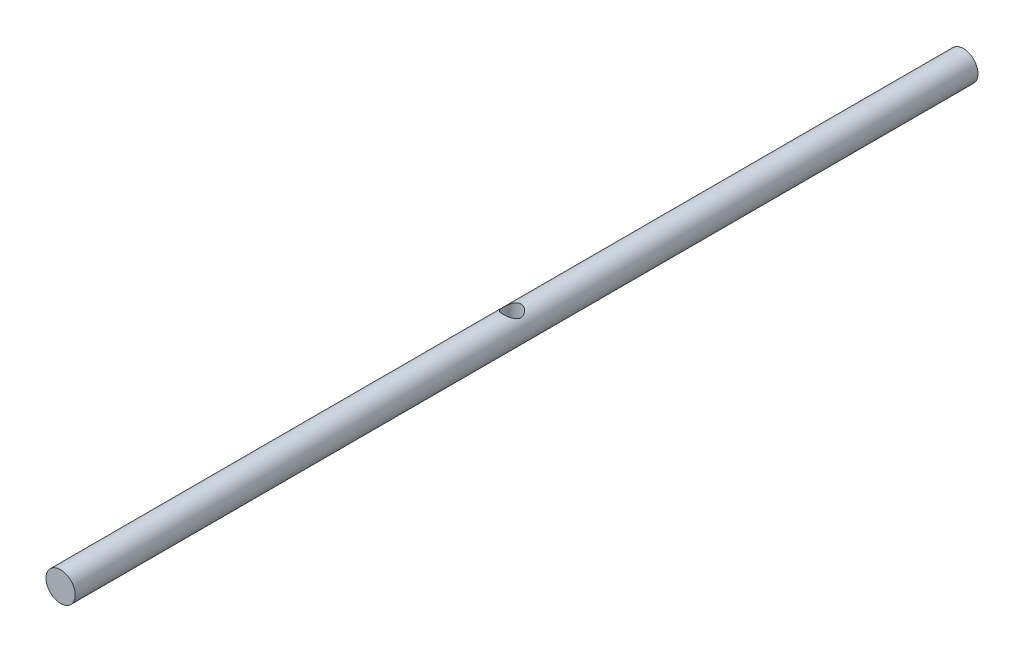
ISO-10303-21;
HEADER;
FILE_DESCRIPTION(('STEP AP214'),'2;1');
FILE_NAME('part.step','',(''),(''),'','','');
FILE_SCHEMA(('AUTOMOTIVE_DESIGN { 1 0 10303 214 1 1 1 1 }'));
ENDSEC;
DATA;
#1=APPLICATION_CONTEXT('core data for automotive mechanical design processes');
#2=APPLICATION_PROTOCOL_DEFINITION('international standard','automotive_design',2000,#1);
#3=PRODUCT_CONTEXT('',#1,'mechanical');
#4=PRODUCT('Part','Part','',(#3));
#5=PRODUCT_RELATED_PRODUCT_CATEGORY('part','',(#4));
#6=PRODUCT_DEFINITION_FORMATION('','',#4);
#7=PRODUCT_DEFINITION_CONTEXT('part definition',#1,'design');
#8=PRODUCT_DEFINITION('design','',#6,#7);
#9=PRODUCT_DEFINITION_SHAPE('','',#8);
#10=(LENGTH_UNIT() NAMED_UNIT(*) SI_UNIT(.MILLI.,.METRE.));
#11=(NAMED_UNIT(*) PLANE_ANGLE_UNIT() SI_UNIT($,.RADIAN.));
#12=(NAMED_UNIT(*) SI_UNIT($,.STERADIAN.) SOLID_ANGLE_UNIT());
#13=UNCERTAINTY_MEASURE_WITH_UNIT(LENGTH_MEASURE(1.E-05),#10,'distance_accuracy_value','');
#14=(GEOMETRIC_REPRESENTATION_CONTEXT(3) GLOBAL_UNCERTAINTY_ASSIGNED_CONTEXT((#13)) GLOBAL_UNIT_ASSIGNED_CONTEXT((#10,
#11,#12)) REPRESENTATION_CONTEXT('',''));
#15=CARTESIAN_POINT('',(0.,0.,0.));
#16=DIRECTION('',(0.,0.,1.));
#17=DIRECTION('',(1.,0.,0.));
#18=AXIS2_PLACEMENT_3D('',#15,#16,#17);
#19=CARTESIAN_POINT('',(0.,0.,386.));
#20=DIRECTION('',(0.,0.,-1.));
#21=DIRECTION('',(-1.,0.,0.));
#22=AXIS2_PLACEMENT_3D('',#19,#20,#21);
#23=CYLINDRICAL_SURFACE('',#22,6.255);
#24=CARTESIAN_POINT('',(-0.0205000000000006,6.25496640678429,196.8315));
#25=CARTESIAN_POINT('',(-0.118305506416799,6.25464520820814,196.831499303967));
#26=CARTESIAN_POINT('',(-0.2161190620889,6.252025590286,196.827749341168));
#27=CARTESIAN_POINT('',(-0.410985589462231,6.24224668802352,196.812803671846));
#28=CARTESIAN_POINT('',(-0.508038143555568,6.23508506663651,196.801604132066));
#29=CARTESIAN_POINT('',(-0.700760015562249,6.21637697776828,196.771890205337));
#30=CARTESIAN_POINT('',(-0.796426738383326,6.20482317075968,196.753363572403));
#31=CARTESIAN_POINT('',(-0.985536515619986,6.17761225127513,196.709250980334));
#32=CARTESIAN_POINT('',(-1.07897860193999,6.1619533867589,196.683662006741));
#33=CARTESIAN_POINT('',(-1.35401526670527,6.10952149641924,196.597062549664));
#34=CARTESIAN_POINT('',(-1.53151168731057,6.06717093767219,196.526030981711));
#35=CARTESIAN_POINT('',(-1.87135387219211,5.97112653096277,196.360145673266));
#36=CARTESIAN_POINT('',(-2.03370245939035,5.91743480263123,196.265296383611));
#37=CARTESIAN_POINT('',(-2.35329219918398,5.79813350963894,196.046130943787));
#38=CARTESIAN_POINT('',(-2.50911373531378,5.73191720151389,195.920077496849));
#39=CARTESIAN_POINT('',(-2.79875369559959,5.59621784083824,195.646041135888));
#40=CARTESIAN_POINT('',(-2.93254223940196,5.52673051371336,195.498028950642));
#41=CARTESIAN_POINT('',(-3.19191582782405,5.38158867658406,195.161775721844));
#42=CARTESIAN_POINT('',(-3.31419927496919,5.30629961562476,194.970807439579));
#43=CARTESIAN_POINT('',(-3.5244954314429,5.16902159474184,194.5665526389));
#44=CARTESIAN_POINT('',(-3.61256654834907,5.10701004931264,194.353304953141));
#45=CARTESIAN_POINT('',(-3.7323381800552,5.01983156958069,193.965753463154));
#46=CARTESIAN_POINT('',(-3.77267741886716,4.98930565346727,193.795331272628));
#47=CARTESIAN_POINT('',(-3.8297047053431,4.94567728090789,193.448481253222));
#48=CARTESIAN_POINT('',(-3.84642437389261,4.93255153130608,193.272061778105));
#49=CARTESIAN_POINT('',(-3.85522291686313,4.92568000682246,192.917812501254));
#50=CARTESIAN_POINT('',(-3.84724533076068,4.93197863799273,192.739980396364));
#51=CARTESIAN_POINT('',(-3.80705501389233,4.96305982434219,192.388683311041));
#52=CARTESIAN_POINT('',(-3.77482320446592,4.98785693050908,192.215221879703));
#53=CARTESIAN_POINT('',(-3.68868820892166,5.05186916649888,191.88007309053));
#54=CARTESIAN_POINT('',(-3.6351769818501,5.09082248336166,191.718232101665));
#55=CARTESIAN_POINT('',(-3.50852472225329,5.17892074395694,191.405451238294));
#56=CARTESIAN_POINT('',(-3.43537666021281,5.22806933591822,191.254515292135));
#57=CARTESIAN_POINT('',(-3.25612823081423,5.34189594597737,190.938480765833));
#58=CARTESIAN_POINT('',(-3.14644772706372,5.40777010238668,190.775841930588));
#59=CARTESIAN_POINT('',(-2.90414979840711,5.54167598928354,190.46954907032));
#60=CARTESIAN_POINT('',(-2.77150938065409,5.60970982623587,190.325914333526));
#61=CARTESIAN_POINT('',(-2.46257798724979,5.75272781838882,190.038990625365));
#62=CARTESIAN_POINT('',(-2.28270826028513,5.82715696913378,189.899199059893));
#63=CARTESIAN_POINT('',(-1.9941871138976,5.92948023266851,189.713960255902));
#64=CARTESIAN_POINT('',(-1.89484180672336,5.96204796274893,189.656266940051));
#65=CARTESIAN_POINT('',(-1.69041727136668,6.02319368610818,189.549632927171));
#66=CARTESIAN_POINT('',(-1.58534162913243,6.05177413560182,189.500686836474));
#67=CARTESIAN_POINT('',(-1.37628020132838,6.10260511740556,189.414711517638));
#68=CARTESIAN_POINT('',(-1.27257319888566,6.12512345995213,189.377162337129));
#69=CARTESIAN_POINT('',(-1.06147802608406,6.16521033903629,189.310964777662));
#70=CARTESIAN_POINT('',(-0.954091993226462,6.18278169682829,189.282311324529));
#71=CARTESIAN_POINT('',(-0.736596931498547,6.21244605292076,189.234367523738));
#72=CARTESIAN_POINT('',(-0.626490237363363,6.22454358741348,189.215069422289));
#73=CARTESIAN_POINT('',(-0.404536634150632,6.24289735258952,189.186153321108));
#74=CARTESIAN_POINT('',(-0.29269000361019,6.24915450864099,189.176533787855));
#75=CARTESIAN_POINT('',(-0.0845346274033475,6.2551670857011,189.167829069644));
#76=CARTESIAN_POINT('',(0.0116988241805115,6.25572716969181,189.167429446251));
#77=CARTESIAN_POINT('',(0.203878822416192,6.25241522950128,189.17386720973));
#78=CARTESIAN_POINT('',(0.299825271921381,6.24854184464961,189.180706818338));
#79=CARTESIAN_POINT('',(0.490621433049446,6.236460919228,189.201533315263));
#80=CARTESIAN_POINT('',(0.585471613359705,6.22825530657535,189.215517024242));
#81=CARTESIAN_POINT('',(0.773440974157554,6.20771898559363,189.250439323158));
#82=CARTESIAN_POINT('',(0.866559473283173,6.19538668833761,189.271380591991));
#83=CARTESIAN_POINT('',(1.13610035415576,6.15357504687465,189.342632868366));
#84=CARTESIAN_POINT('',(1.30937905777416,6.11882018872013,189.402137297521));
#85=CARTESIAN_POINT('',(1.64330678361282,6.03773139318207,189.543827395177));
#86=CARTESIAN_POINT('',(1.8039535408616,5.99139538543578,189.626017119405));
#87=CARTESIAN_POINT('',(2.12582185921767,5.88535608947606,189.819988914226));
#88=CARTESIAN_POINT('',(2.28545463596136,5.82477436775582,189.933924678523));
#89=CARTESIAN_POINT('',(2.58450872880197,5.69840041093401,190.183558175329));
#90=CARTESIAN_POINT('',(2.72390689938849,5.63260233997725,190.319280460751));
#91=CARTESIAN_POINT('',(2.99835624765369,5.49197349000712,190.630265696539));
#92=CARTESIAN_POINT('',(3.13017362866458,5.41714483336287,190.808399519418));
#93=CARTESIAN_POINT('',(3.36233021086422,5.27619392703981,191.187240765077));
#94=CARTESIAN_POINT('',(3.46269614530441,5.21006431120503,191.387928818867));
#95=CARTESIAN_POINT('',(3.61063481548886,5.10829362578069,191.764244310252));
#96=CARTESIAN_POINT('',(3.66486528473673,5.06916696902973,191.936299118696));
#97=CARTESIAN_POINT('',(3.74881115235728,5.00741486890287,192.289054865359));
#98=CARTESIAN_POINT('',(3.77856255142882,4.98476519897706,192.469742691637));
#99=CARTESIAN_POINT('',(3.81190772472173,4.95932155659445,192.835828862093));
#100=CARTESIAN_POINT('',(3.81537945533544,4.95662022627017,193.021245176574));
#101=CARTESIAN_POINT('',(3.79558674673987,4.97178817837025,193.38982934638));
#102=CARTESIAN_POINT('',(3.77231033090546,4.98966667552811,193.572996157349));
#103=CARTESIAN_POINT('',(3.70284687203561,5.04139220407209,193.92001335673));
#104=CARTESIAN_POINT('',(3.65821607933139,5.07414780567524,194.084350593611));
#105=CARTESIAN_POINT('',(3.5487855286894,5.15127286340252,194.403226886045));
#106=CARTESIAN_POINT('',(3.48397792460709,5.19564683648655,194.557762101702));
#107=CARTESIAN_POINT('',(3.32501000115017,5.29901586105711,194.877327933413));
#108=CARTESIAN_POINT('',(3.22792053496968,5.35920351415077,195.040511290692));
#109=CARTESIAN_POINT('',(3.01169963042592,5.48363929929432,195.349862207444));
#110=CARTESIAN_POINT('',(2.89255004444238,5.54789074553735,195.496015594851));
#111=CARTESIAN_POINT('',(2.61061617973078,5.68669368716339,195.794058660342));
#112=CARTESIAN_POINT('',(2.4438400051743,5.76104226732685,195.942336534717));
#113=CARTESIAN_POINT('',(2.17455248557415,5.8656369406202,196.142401789013));
#114=CARTESIAN_POINT('',(2.08151393420995,5.89937332422361,196.205409777724));
#115=CARTESIAN_POINT('',(1.8894685603901,5.96365318906356,196.323415957564));
#116=CARTESIAN_POINT('',(1.79046504524541,5.99419841443285,196.378418530598));
#117=CARTESIAN_POINT('',(1.58870198871177,6.05077285992892,196.478988402412));
#118=CARTESIAN_POINT('',(1.48603085638833,6.07686801849241,196.524695844675));
#119=CARTESIAN_POINT('',(1.2761709911933,6.12437540031851,196.607178271733));
#120=CARTESIAN_POINT('',(1.16898492874462,6.1457903466337,196.643958451993));
#121=CARTESIAN_POINT('',(0.951215861513999,6.18323429849068,196.707965122189));
#122=CARTESIAN_POINT('',(0.840643354838676,6.19927840933486,196.735218415917));
#123=CARTESIAN_POINT('',(0.616901691679627,6.22552188942671,196.779828607654));
#124=CARTESIAN_POINT('',(0.503734643934526,6.23572584159628,196.797193265473));
#125=CARTESIAN_POINT('',(0.321811604777753,6.24708904176543,196.816792663888));
#126=CARTESIAN_POINT('',(0.253511704369987,6.25023563950904,196.822303958083));
#127=CARTESIAN_POINT('',(0.116642530242228,6.25428697603262,196.829657959967));
#128=CARTESIAN_POINT('',(0.0480732434954898,6.25519160502701,196.831500488001));
#129=CARTESIAN_POINT('',(-0.0205000000000006,6.25496640678429,196.8315));
#130=B_SPLINE_CURVE_WITH_KNOTS('',3,(#24,#25,#26,#27,#28,#29,#30,#31,#32,#33,#34,#35,#36,#37,
#38,#39,#40,#41,#42,#43,#44,#45,#46,#47,#48,#49,#50,#51,#52,#53,#54,#55,#56,#57,#58,#59,#60,#61,
#62,#63,#64,#65,#66,#67,#68,#69,#70,#71,#72,#73,#74,#75,#76,#77,#78,#79,#80,#81,#82,#83,#84,#85,
#86,#87,#88,#89,#90,#91,#92,#93,#94,#95,#96,#97,#98,#99,#100,#101,#102,#103,#104,#105,#106,#107,
#108,#109,#110,#111,#112,#113,#114,#115,#116,#117,#118,#119,#120,#121,#122,#123,#124,#125,#126,
#127,#128,#129),.UNSPECIFIED.,.T.,.F.,(4,2,2,2,2,2,2,2,2,2,2,2,2,2,2,2,2,2,2,2,2,2,2,2,2,2,2,2,
2,2,2,2,2,2,2,2,2,2,2,2,2,2,2,2,2,2,2,2,2,2,2,2,4),(0.,0.293346524483824,0.586844110353164,
0.880834314427112,1.1749501985029,1.75959125916567,2.34412314868345,2.97488836161688,
3.60650207424635,4.31984455339048,5.0319637992648,5.56304607456074,6.09341668330874,
6.62500066971733,7.15700324409188,7.67962954080979,8.2024431752422,8.82089113328285,
9.43996204779669,10.1548921624995,10.5127007453723,10.8702879311259,11.2075086079954,
11.5445365772839,11.8812847355031,12.2179795292108,12.5063219164995,12.7947528223275,
13.0830554794052,13.3714692716966,13.9283582299254,14.4853468145203,15.0987322882274,
15.7128139502625,16.4113403072305,17.1092713067659,17.6608135227297,18.2115431434327,
18.7648288098709,19.3183623094755,19.8365844983754,20.3550084602674,20.950388741105,
21.5462610017726,22.2482260594639,22.5998177635665,22.9512162881258,23.2968427357151,
23.642267551539,23.9867125449186,24.3308868715933,24.5365474567911,24.7422181126564),.UNSPECIFIED.);
#131=CARTESIAN_POINT('',(-0.0205000000000006,6.25496640678429,196.8315));
#132=VERTEX_POINT('',#131);
#133=EDGE_CURVE('E47',#132,#132,#130,.T.);
#134=ORIENTED_EDGE('',*,*,#133,.T.);
#135=EDGE_LOOP('',(#134));
#136=FACE_BOUND('',#135,.T.);
#137=CARTESIAN_POINT('',(0.,-6.255,189.168554841838));
#138=CARTESIAN_POINT('',(-0.097639564683165,-6.2549993775192,189.168033088996));
#139=CARTESIAN_POINT('',(-0.195313800236939,-6.25270818214158,189.17124786707));
#140=CARTESIAN_POINT('',(-0.389959193150543,-6.24359349200584,189.185105364826));
#141=CARTESIAN_POINT('',(-0.486929970134621,-6.2367677066937,189.195751838615));
#142=CARTESIAN_POINT('',(-0.679542562803123,-6.21873075221591,189.224348386637));
#143=CARTESIAN_POINT('',(-0.775181936873352,-6.20751240592242,189.2423104159));
#144=CARTESIAN_POINT('',(-0.964293079724732,-6.1809631534874,189.285290261761));
#145=CARTESIAN_POINT('',(-1.05776390797499,-6.16563049784208,189.310311080159));
#146=CARTESIAN_POINT('',(-1.33298059314901,-6.1141454276505,189.395220750079));
#147=CARTESIAN_POINT('',(-1.51070537495717,-6.07238955981197,189.465135929018));
#148=CARTESIAN_POINT('',(-1.85117382152184,-5.97741824903593,189.62882828129));
#149=CARTESIAN_POINT('',(-2.01392008315119,-5.92420479789803,189.722601307661));
#150=CARTESIAN_POINT('',(-2.33427714210441,-5.80581818665973,189.939431428188));
#151=CARTESIAN_POINT('',(-2.49050337672382,-5.74003666017124,190.064199203885));
#152=CARTESIAN_POINT('',(-2.78114838758926,-5.60499696112452,190.335635505269));
#153=CARTESIAN_POINT('',(-2.91553812638762,-5.53573431707437,190.482332702546));
#154=CARTESIAN_POINT('',(-3.17662885532012,-5.39065239815689,190.816004568219));
#155=CARTESIAN_POINT('',(-3.30001564887059,-5.31516301223399,191.00573814511));
#156=CARTESIAN_POINT('',(-3.51279434953523,-5.17701120038061,191.40759781688));
#157=CARTESIAN_POINT('',(-3.60224108818486,-5.11432816156537,191.619687080664));
#158=CARTESIAN_POINT('',(-3.72492136479316,-5.02535840392579,192.006119753004));
#159=CARTESIAN_POINT('',(-3.76662992147904,-4.99388498080275,192.176571040231));
#160=CARTESIAN_POINT('',(-3.82635056740125,-4.9482851626129,192.523752103587));
#161=CARTESIAN_POINT('',(-3.84439500569386,-4.93413508814119,192.700472968797));
#162=CARTESIAN_POINT('',(-3.85572382009671,-4.92529035875454,193.055666431024));
#163=CARTESIAN_POINT('',(-3.84894495070207,-4.93064539932251,193.234142345488));
#164=CARTESIAN_POINT('',(-3.81093895113058,-4.9600713871914,193.586940572687));
#165=CARTESIAN_POINT('',(-3.77969316376541,-4.98415661705585,193.761259611032));
#166=CARTESIAN_POINT('',(-3.69550076570989,-5.04687421765199,194.097326806954));
#167=CARTESIAN_POINT('',(-3.64306471141795,-5.08516270782034,194.259270869558));
#168=CARTESIAN_POINT('',(-3.51855587060529,-5.17209280381359,194.572394992226));
#169=CARTESIAN_POINT('',(-3.44647607058166,-5.22073810602219,194.723571183423));
#170=CARTESIAN_POINT('',(-3.26979660954892,-5.33350598778777,195.039831184056));
#171=CARTESIAN_POINT('',(-3.16167853410965,-5.39883829972001,195.202518868358));
#172=CARTESIAN_POINT('',(-2.922632813007,-5.53190987253006,195.509164176448));
#173=CARTESIAN_POINT('',(-2.79168246698985,-5.59965147491384,195.653102908414));
#174=CARTESIAN_POINT('',(-2.48598279645967,-5.74261134968067,195.941521810007));
#175=CARTESIAN_POINT('',(-2.30758082648801,-5.81731115934776,196.082466279032));
#176=CARTESIAN_POINT('',(-2.02117920576267,-5.9203236531853,196.269667566432));
#177=CARTESIAN_POINT('',(-1.92252461229564,-5.95316916925852,196.328055323073));
#178=CARTESIAN_POINT('',(-1.71943954116192,-6.01496339777407,196.436161275416));
#179=CARTESIAN_POINT('',(-1.6150126302689,-6.04391447947615,196.485884747703));
#180=CARTESIAN_POINT('',(-1.4066617624155,-6.09567432862483,196.573660964466));
#181=CARTESIAN_POINT('',(-1.30299796371733,-6.11872539563679,196.612188591318));
#182=CARTESIAN_POINT('',(-1.09188222239957,-6.15990029722519,196.680329292043));
#183=CARTESIAN_POINT('',(-0.984432474460139,-6.1780269350401,196.709947438685));
#184=CARTESIAN_POINT('',(-0.766699926707875,-6.20880620836352,196.759792595574));
#185=CARTESIAN_POINT('',(-0.656419614333845,-6.22146348676798,196.780027572192));
#186=CARTESIAN_POINT('',(-0.434006467240749,-6.24092275997481,196.810774355219));
#187=CARTESIAN_POINT('',(-0.321873936918663,-6.24772570732089,196.821287743424));
#188=CARTESIAN_POINT('',(-0.113162516554198,-6.2547182236699,196.831591875384));
#189=CARTESIAN_POINT('',(-0.0166734948574246,-6.25572027732458,196.832710698185));
#190=CARTESIAN_POINT('',(0.17608951487576,-6.25326395532742,196.827668040449));
#191=CARTESIAN_POINT('',(0.272363427739662,-6.24980420920178,196.821504323076));
#192=CARTESIAN_POINT('',(0.463876034317253,-6.23851238921017,196.801977022357));
#193=CARTESIAN_POINT('',(0.559115181706528,-6.23068231739488,196.788616735864));
#194=CARTESIAN_POINT('',(0.747914136758425,-6.21085192790001,196.754882847795));
#195=CARTESIAN_POINT('',(0.841473283807736,-6.19885000595353,196.73450654827));
#196=CARTESIAN_POINT('',(1.11170053229864,-6.15803323435032,196.664989573438));
#197=CARTESIAN_POINT('',(1.28531139718804,-6.12392848101493,196.606664575163));
#198=CARTESIAN_POINT('',(1.62007008509218,-6.04401540785852,196.46725973837));
#199=CARTESIAN_POINT('',(1.7812157315072,-5.99820505005957,196.386175937238));
#200=CARTESIAN_POINT('',(2.10391330574417,-5.89322557604781,196.194659133941));
#201=CARTESIAN_POINT('',(2.26392683773901,-5.83318303504096,196.082115588607));
#202=CARTESIAN_POINT('',(2.56394735895883,-5.70768915422553,195.835285293289));
#203=CARTESIAN_POINT('',(2.70393201737539,-5.64223190370069,195.700974624714));
#204=CARTESIAN_POINT('',(2.97998101973985,-5.50198738500353,195.392910065576));
#205=CARTESIAN_POINT('',(3.1128223643338,-5.42716245841967,195.216269943601));
#206=CARTESIAN_POINT('',(3.34733589743369,-5.28574821954556,194.840392524292));
#207=CARTESIAN_POINT('',(3.44903185094521,-5.21915265123429,194.641172615949));
#208=CARTESIAN_POINT('',(3.6001415622322,-5.11572365507136,194.266255581658));
#209=CARTESIAN_POINT('',(3.65599363949177,-5.07558901665293,194.094077092027));
#210=CARTESIAN_POINT('',(3.74309487084838,-5.01170938611661,193.740766831481));
#211=CARTESIAN_POINT('',(3.77438027558196,-4.98794025143371,193.559648673325));
#212=CARTESIAN_POINT('',(3.81063665554651,-4.96030676170638,193.192305616799));
#213=CARTESIAN_POINT('',(3.81547758868982,-4.95654077570662,193.006060000249));
#214=CARTESIAN_POINT('',(3.79813702175633,-4.96983683884429,192.635548899176));
#215=CARTESIAN_POINT('',(3.77594479563989,-4.98690715527862,192.451284229913));
#216=CARTESIAN_POINT('',(3.70844384158249,-5.0372659338351,192.102947636035));
#217=CARTESIAN_POINT('',(3.66483368012437,-5.06935558286628,191.938359271456));
#218=CARTESIAN_POINT('',(3.55738524305724,-5.14532277032284,191.61885136016));
#219=CARTESIAN_POINT('',(3.49353896553253,-5.18920497080066,191.463935667339));
#220=CARTESIAN_POINT('',(3.33689359681616,-5.29151267570675,191.144079288865));
#221=CARTESIAN_POINT('',(3.2412456414669,-5.35112311563401,190.98091908398));
#222=CARTESIAN_POINT('',(3.02798516879787,-5.47462605359969,190.671373914244));
#223=CARTESIAN_POINT('',(2.91035491994927,-5.53852198156823,190.52500264672));
#224=CARTESIAN_POINT('',(2.63165890142595,-5.67695154180459,190.225932937454));
#225=CARTESIAN_POINT('',(2.46658532092416,-5.75132194415905,190.076867202969));
#226=CARTESIAN_POINT('',(2.11041761064706,-5.89132140020719,189.807937150376));
#227=CARTESIAN_POINT('',(1.91931023763247,-5.95694597111636,189.688087781583));
#228=CARTESIAN_POINT('',(1.61760923922341,-6.0431130634715,189.534516410145));
#229=CARTESIAN_POINT('',(1.51513534614407,-6.06967819248439,189.48787772304));
#230=CARTESIAN_POINT('',(1.30555178216812,-6.11817740890897,189.40351370667));
#231=CARTESIAN_POINT('',(1.1984448368046,-6.14011417562299,189.365783219043));
#232=CARTESIAN_POINT('',(0.980733157078305,-6.17862290755498,189.299887994654));
#233=CARTESIAN_POINT('',(0.87013921698786,-6.19520992762596,189.271696403064));
#234=CARTESIAN_POINT('',(0.646241276630356,-6.22254712542595,189.225228559089));
#235=CARTESIAN_POINT('',(0.532939471660076,-6.23330187434865,189.206944541394));
#236=CARTESIAN_POINT('',(0.349456717022954,-6.24561897055041,189.185761629763));
#237=CARTESIAN_POINT('',(0.27975831987159,-6.24913171048544,189.179641931233));
#238=CARTESIAN_POINT('',(0.14004590608652,-6.25382251689055,189.171225538522));
#239=CARTESIAN_POINT('',(0.0700318711885523,-6.25500044647367,189.168929068495));
#240=CARTESIAN_POINT('',(0.,-6.255,189.168554841838));
#241=B_SPLINE_CURVE_WITH_KNOTS('',3,(#137,#138,#139,#140,#141,#142,#143,#144,#145,#146,#147,
#148,#149,#150,#151,#152,#153,#154,#155,#156,#157,#158,#159,#160,#161,#162,#163,#164,#165,#166,
#167,#168,#169,#170,#171,#172,#173,#174,#175,#176,#177,#178,#179,#180,#181,#182,#183,#184,#185,
#186,#187,#188,#189,#190,#191,#192,#193,#194,#195,#196,#197,#198,#199,#200,#201,#202,#203,#204,
#205,#206,#207,#208,#209,#210,#211,#212,#213,#214,#215,#216,#217,#218,#219,#220,#221,#222,#223,
#224,#225,#226,#227,#228,#229,#230,#231,#232,#233,#234,#235,#236,#237,#238,#239,#240),
.UNSPECIFIED.,.T.,.F.,(4,2,2,2,2,2,2,2,2,2,2,2,2,2,2,2,2,2,2,2,2,2,2,2,2,2,2,2,2,2,2,2,2,2,2,2,
2,2,2,2,2,2,2,2,2,2,2,2,2,2,2,4),(0.,0.292850075001541,0.585848189734401,0.879327053528585,
1.17293090993168,1.75660263365754,2.34017297301652,2.96914405972919,3.59894480498652,
4.31125984447841,5.02241916026674,5.55503097906237,6.08691395128653,6.62015301133487,
7.15379908796617,7.67528876889685,8.19696488432571,8.81256056768368,9.42877181679757,
10.1427270559757,10.5000637745907,10.8571821072263,11.1955949035386,11.5338146522818,
11.8717467222074,12.2096237976416,12.4987576746902,12.787980382438,13.077070705582,
13.3662723203676,13.9226039365823,14.4790324777363,15.0905338273862,15.702711732927,
16.399601907258,17.095958997891,17.6499396754887,18.2031013537434,18.7589808013855,
19.315080879088,19.8328552862278,20.3508346915528,20.943578784034,21.5368030804448,
22.2371802144344,22.9379149659613,23.2845171308073,23.630918098025,23.9763355674425,
24.3214819142371,24.5315159971981,24.7415623938266),.UNSPECIFIED.);
#242=CARTESIAN_POINT('',(0.,-6.255,189.168554841838));
#243=VERTEX_POINT('',#242);
#244=EDGE_CURVE('E10',#243,#243,#241,.T.);
#245=ORIENTED_EDGE('',*,*,#244,.T.);
#246=EDGE_LOOP('',(#245));
#247=FACE_BOUND('',#246,.T.);
#248=CARTESIAN_POINT('',(0.,0.,386.));
#249=DIRECTION('',(0.,0.,1.));
#250=DIRECTION('',(1.,0.,0.));
#251=AXIS2_PLACEMENT_3D('',#248,#249,#250);
#252=CIRCLE('',#251,6.255);
#253=CARTESIAN_POINT('',(6.255,0.,386.));
#254=VERTEX_POINT('',#253);
#255=EDGE_CURVE('E56',#254,#254,#252,.T.);
#256=ORIENTED_EDGE('',*,*,#255,.F.);
#257=EDGE_LOOP('',(#256));
#258=FACE_BOUND('',#257,.T.);
#259=CARTESIAN_POINT('',(0.,0.,0.));
#260=DIRECTION('',(0.,0.,1.));
#261=DIRECTION('',(1.,0.,0.));
#262=AXIS2_PLACEMENT_3D('',#259,#260,#261);
#263=CIRCLE('',#262,6.255);
#264=CARTESIAN_POINT('',(6.255,0.,0.));
#265=VERTEX_POINT('',#264);
#266=EDGE_CURVE('E61',#265,#265,#263,.T.);
#267=ORIENTED_EDGE('',*,*,#266,.T.);
#268=EDGE_LOOP('',(#267));
#269=FACE_BOUND('',#268,.T.);
#270=ADVANCED_FACE('F43',(#136,#247,#258,#269),#23,.T.);
#271=CARTESIAN_POINT('',(0.,0.,386.));
#272=DIRECTION('',(0.,0.,1.));
#273=DIRECTION('',(1.,0.,0.));
#274=AXIS2_PLACEMENT_3D('',#271,#272,#273);
#275=PLANE('',#274);
#276=ORIENTED_EDGE('',*,*,#255,.T.);
#277=EDGE_LOOP('',(#276));
#278=FACE_BOUND('',#277,.T.);
#279=ADVANCED_FACE('F73',(#278),#275,.T.);
#280=CARTESIAN_POINT('',(0.,0.,0.));
#281=DIRECTION('',(0.,0.,1.));
#282=DIRECTION('',(1.,0.,0.));
#283=AXIS2_PLACEMENT_3D('',#280,#281,#282);
#284=PLANE('',#283);
#285=ORIENTED_EDGE('',*,*,#266,.F.);
#286=EDGE_LOOP('',(#285));
#287=FACE_BOUND('',#286,.T.);
#288=ADVANCED_FACE('F71',(#287),#284,.F.);
#289=CARTESIAN_POINT('',(-0.0205000000000006,-6.255,193.));
#290=DIRECTION('',(0.,1.,0.));
#291=DIRECTION('',(0.,0.,1.));
#292=AXIS2_PLACEMENT_3D('',#289,#290,#291);
#293=CYLINDRICAL_SURFACE('',#292,3.83150000000001);
#294=ORIENTED_EDGE('',*,*,#133,.F.);
#295=EDGE_LOOP('',(#294));
#296=FACE_BOUND('',#295,.T.);
#297=ORIENTED_EDGE('',*,*,#244,.F.);
#298=EDGE_LOOP('',(#297));
#299=FACE_BOUND('',#298,.T.);
#300=ADVANCED_FACE('F67',(#296,#299),#293,.F.);
#301=CLOSED_SHELL('',(#270,#279,#288,#300));
#302=MANIFOLD_SOLID_BREP('B2',#301);
#303=ADVANCED_BREP_SHAPE_REPRESENTATION('',(#18,#302),#14);
#304=SHAPE_DEFINITION_REPRESENTATION(#9,#303);
ENDSEC;
END-ISO-10303-21;
